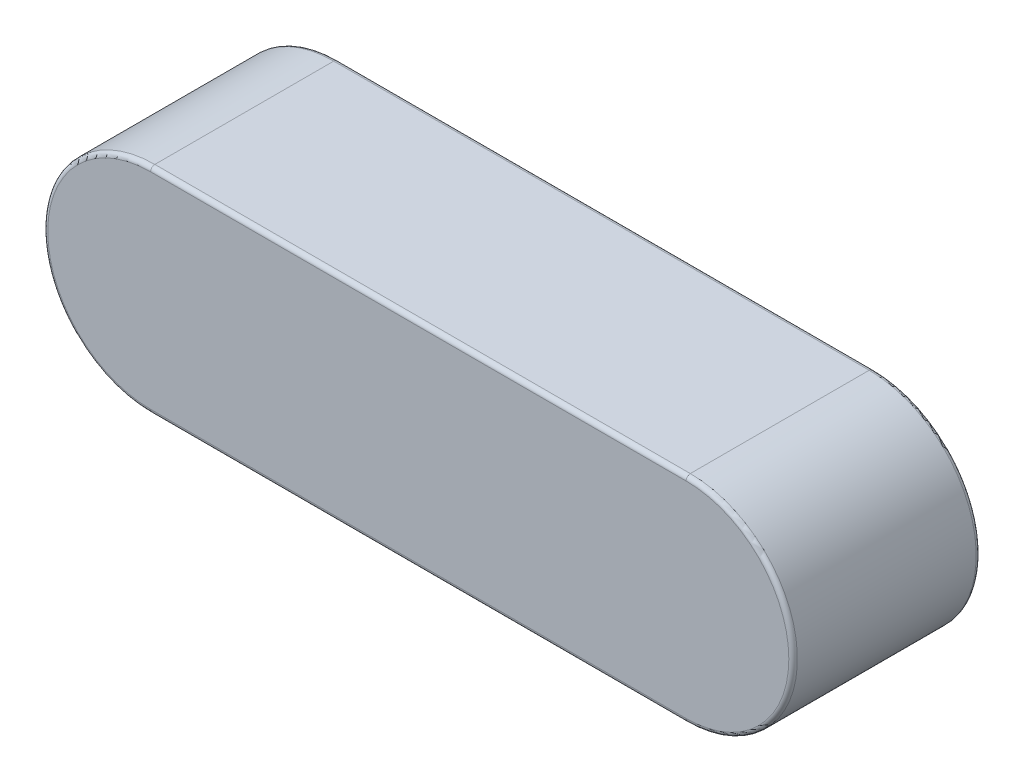
ISO-10303-21;
HEADER;
FILE_DESCRIPTION(('STEP AP214'),'2;1');
FILE_NAME('part.step','',(''),(''),'','','');
FILE_SCHEMA(('AUTOMOTIVE_DESIGN { 1 0 10303 214 1 1 1 1 }'));
ENDSEC;
DATA;
#1=APPLICATION_CONTEXT('core data for automotive mechanical design processes');
#2=APPLICATION_PROTOCOL_DEFINITION('international standard','automotive_design',2000,#1);
#3=PRODUCT_CONTEXT('',#1,'mechanical');
#4=PRODUCT('Part','Part','',(#3));
#5=PRODUCT_RELATED_PRODUCT_CATEGORY('part','',(#4));
#6=PRODUCT_DEFINITION_FORMATION('','',#4);
#7=PRODUCT_DEFINITION_CONTEXT('part definition',#1,'design');
#8=PRODUCT_DEFINITION('design','',#6,#7);
#9=PRODUCT_DEFINITION_SHAPE('','',#8);
#10=(LENGTH_UNIT() NAMED_UNIT(*) SI_UNIT(.MILLI.,.METRE.));
#11=(NAMED_UNIT(*) PLANE_ANGLE_UNIT() SI_UNIT($,.RADIAN.));
#12=(NAMED_UNIT(*) SI_UNIT($,.STERADIAN.) SOLID_ANGLE_UNIT());
#13=UNCERTAINTY_MEASURE_WITH_UNIT(LENGTH_MEASURE(1.E-05),#10,'distance_accuracy_value','');
#14=(GEOMETRIC_REPRESENTATION_CONTEXT(3) GLOBAL_UNCERTAINTY_ASSIGNED_CONTEXT((#13)) GLOBAL_UNIT_ASSIGNED_CONTEXT((#10,
#11,#12)) REPRESENTATION_CONTEXT('',''));
#15=CARTESIAN_POINT('',(0.,0.,0.));
#16=DIRECTION('',(0.,0.,1.));
#17=DIRECTION('',(1.,0.,0.));
#18=AXIS2_PLACEMENT_3D('',#15,#16,#17);
#19=CARTESIAN_POINT('',(0.,0.,7.));
#20=DIRECTION('',(0.,0.,-1.));
#21=DIRECTION('',(-1.,0.,0.));
#22=AXIS2_PLACEMENT_3D('',#19,#20,#21);
#23=CYLINDRICAL_SURFACE('',#22,4.);
#24=DIRECTION('',(0.,0.,-1.));
#25=VECTOR('',#24,1.);
#26=CARTESIAN_POINT('',(0.,4.,7.));
#27=LINE('',#26,#25);
#28=CARTESIAN_POINT('',(0.,4.,6.84));
#29=VERTEX_POINT('',#28);
#30=CARTESIAN_POINT('',(0.,4.,0.16));
#31=VERTEX_POINT('',#30);
#32=EDGE_CURVE('E164',#29,#31,#27,.T.);
#33=ORIENTED_EDGE('',*,*,#32,.T.);
#34=CARTESIAN_POINT('',(0.,0.,0.16));
#35=DIRECTION('',(0.,0.,1.));
#36=DIRECTION('',(1.,0.,0.));
#37=AXIS2_PLACEMENT_3D('',#34,#35,#36);
#38=CIRCLE('',#37,4.);
#39=CARTESIAN_POINT('',(0.,-4.,0.16));
#40=VERTEX_POINT('',#39);
#41=EDGE_CURVE('E178',#31,#40,#38,.T.);
#42=ORIENTED_EDGE('',*,*,#41,.T.);
#43=DIRECTION('',(0.,0.,-1.));
#44=VECTOR('',#43,1.);
#45=CARTESIAN_POINT('',(0.,-4.,7.));
#46=LINE('',#45,#44);
#47=CARTESIAN_POINT('',(0.,-4.,6.84));
#48=VERTEX_POINT('',#47);
#49=EDGE_CURVE('E135',#48,#40,#46,.T.);
#50=ORIENTED_EDGE('',*,*,#49,.F.);
#51=CARTESIAN_POINT('',(0.,0.,6.84));
#52=DIRECTION('',(0.,0.,1.));
#53=DIRECTION('',(1.,0.,0.));
#54=AXIS2_PLACEMENT_3D('',#51,#52,#53);
#55=CIRCLE('',#54,4.);
#56=EDGE_CURVE('E181',#48,#29,#55,.F.);
#57=ORIENTED_EDGE('',*,*,#56,.T.);
#58=EDGE_LOOP('',(#33,#42,#50,#57));
#59=FACE_BOUND('',#58,.T.);
#60=ADVANCED_FACE('F45',(#59),#23,.T.);
#61=CARTESIAN_POINT('',(0.,-4.,7.));
#62=DIRECTION('',(0.,1.,0.));
#63=DIRECTION('',(0.,0.,1.));
#64=AXIS2_PLACEMENT_3D('',#61,#62,#63);
#65=PLANE('',#64);
#66=ORIENTED_EDGE('',*,*,#49,.T.);
#67=DIRECTION('',(1.,0.,0.));
#68=VECTOR('',#67,1.);
#69=CARTESIAN_POINT('',(0.,-4.,0.16));
#70=LINE('',#69,#68);
#71=CARTESIAN_POINT('',(20.,-4.,0.16));
#72=VERTEX_POINT('',#71);
#73=EDGE_CURVE('E133',#40,#72,#70,.T.);
#74=ORIENTED_EDGE('',*,*,#73,.T.);
#75=DIRECTION('',(0.,0.,-1.));
#76=VECTOR('',#75,1.);
#77=CARTESIAN_POINT('',(20.,-4.,7.));
#78=LINE('',#77,#76);
#79=CARTESIAN_POINT('',(20.,-4.,6.84));
#80=VERTEX_POINT('',#79);
#81=EDGE_CURVE('E115',#80,#72,#78,.T.);
#82=ORIENTED_EDGE('',*,*,#81,.F.);
#83=DIRECTION('',(1.,0.,0.));
#84=VECTOR('',#83,1.);
#85=CARTESIAN_POINT('',(0.,-4.,6.84));
#86=LINE('',#85,#84);
#87=EDGE_CURVE('E130',#80,#48,#86,.F.);
#88=ORIENTED_EDGE('',*,*,#87,.T.);
#89=EDGE_LOOP('',(#66,#74,#82,#88));
#90=FACE_BOUND('',#89,.T.);
#91=ADVANCED_FACE('F129',(#90),#65,.F.);
#92=CARTESIAN_POINT('',(20.,0.,7.));
#93=DIRECTION('',(0.,0.,-1.));
#94=DIRECTION('',(-1.,0.,0.));
#95=AXIS2_PLACEMENT_3D('',#92,#93,#94);
#96=CYLINDRICAL_SURFACE('',#95,4.);
#97=ORIENTED_EDGE('',*,*,#81,.T.);
#98=CARTESIAN_POINT('',(20.,0.,0.16));
#99=DIRECTION('',(0.,0.,1.));
#100=DIRECTION('',(1.,0.,0.));
#101=AXIS2_PLACEMENT_3D('',#98,#99,#100);
#102=CIRCLE('',#101,4.);
#103=CARTESIAN_POINT('',(20.,4.,0.16));
#104=VERTEX_POINT('',#103);
#105=EDGE_CURVE('E122',#72,#104,#102,.T.);
#106=ORIENTED_EDGE('',*,*,#105,.T.);
#107=DIRECTION('',(0.,0.,-1.));
#108=VECTOR('',#107,1.);
#109=CARTESIAN_POINT('',(20.,4.,7.));
#110=LINE('',#109,#108);
#111=CARTESIAN_POINT('',(20.,4.,6.84));
#112=VERTEX_POINT('',#111);
#113=EDGE_CURVE('E117',#112,#104,#110,.T.);
#114=ORIENTED_EDGE('',*,*,#113,.F.);
#115=CARTESIAN_POINT('',(20.,0.,6.84));
#116=DIRECTION('',(0.,0.,1.));
#117=DIRECTION('',(1.,0.,0.));
#118=AXIS2_PLACEMENT_3D('',#115,#116,#117);
#119=CIRCLE('',#118,4.);
#120=EDGE_CURVE('E112',#112,#80,#119,.F.);
#121=ORIENTED_EDGE('',*,*,#120,.T.);
#122=EDGE_LOOP('',(#97,#106,#114,#121));
#123=FACE_BOUND('',#122,.T.);
#124=ADVANCED_FACE('F114',(#123),#96,.T.);
#125=CARTESIAN_POINT('',(0.,4.,7.));
#126=DIRECTION('',(0.,-1.,0.));
#127=DIRECTION('',(0.,0.,-1.));
#128=AXIS2_PLACEMENT_3D('',#125,#126,#127);
#129=PLANE('',#128);
#130=ORIENTED_EDGE('',*,*,#113,.T.);
#131=DIRECTION('',(-1.,0.,0.));
#132=VECTOR('',#131,1.);
#133=CARTESIAN_POINT('',(0.,4.,0.16));
#134=LINE('',#133,#132);
#135=EDGE_CURVE('E184',#104,#31,#134,.T.);
#136=ORIENTED_EDGE('',*,*,#135,.T.);
#137=ORIENTED_EDGE('',*,*,#32,.F.);
#138=DIRECTION('',(-1.,0.,0.));
#139=VECTOR('',#138,1.);
#140=CARTESIAN_POINT('',(20.,4.,6.84));
#141=LINE('',#140,#139);
#142=EDGE_CURVE('E187',#29,#112,#141,.F.);
#143=ORIENTED_EDGE('',*,*,#142,.T.);
#144=EDGE_LOOP('',(#130,#136,#137,#143));
#145=FACE_BOUND('',#144,.T.);
#146=ADVANCED_FACE('F235',(#145),#129,.F.);
#147=CARTESIAN_POINT('',(0.,0.,7.));
#148=DIRECTION('',(0.,0.,1.));
#149=DIRECTION('',(1.,0.,0.));
#150=AXIS2_PLACEMENT_3D('',#147,#148,#149);
#151=PLANE('',#150);
#152=CARTESIAN_POINT('',(20.,0.,7.));
#153=DIRECTION('',(0.,0.,1.));
#154=DIRECTION('',(1.,0.,0.));
#155=AXIS2_PLACEMENT_3D('',#152,#153,#154);
#156=CIRCLE('',#155,3.84);
#157=CARTESIAN_POINT('',(20.,-3.84,7.));
#158=VERTEX_POINT('',#157);
#159=CARTESIAN_POINT('',(20.,3.84,7.));
#160=VERTEX_POINT('',#159);
#161=EDGE_CURVE('E55',#158,#160,#156,.T.);
#162=ORIENTED_EDGE('',*,*,#161,.T.);
#163=DIRECTION('',(-1.,0.,0.));
#164=VECTOR('',#163,1.);
#165=CARTESIAN_POINT('',(0.,3.84,7.));
#166=LINE('',#165,#164);
#167=CARTESIAN_POINT('',(0.,3.84,7.));
#168=VERTEX_POINT('',#167);
#169=EDGE_CURVE('E11',#160,#168,#166,.T.);
#170=ORIENTED_EDGE('',*,*,#169,.T.);
#171=CARTESIAN_POINT('',(0.,0.,7.));
#172=DIRECTION('',(0.,0.,1.));
#173=DIRECTION('',(1.,0.,0.));
#174=AXIS2_PLACEMENT_3D('',#171,#172,#173);
#175=CIRCLE('',#174,3.84);
#176=CARTESIAN_POINT('',(0.,-3.84,7.));
#177=VERTEX_POINT('',#176);
#178=EDGE_CURVE('E175',#168,#177,#175,.T.);
#179=ORIENTED_EDGE('',*,*,#178,.T.);
#180=DIRECTION('',(1.,0.,0.));
#181=VECTOR('',#180,1.);
#182=CARTESIAN_POINT('',(20.,-3.84,7.));
#183=LINE('',#182,#181);
#184=EDGE_CURVE('E66',#177,#158,#183,.T.);
#185=ORIENTED_EDGE('',*,*,#184,.T.);
#186=EDGE_LOOP('',(#162,#170,#179,#185));
#187=FACE_BOUND('',#186,.T.);
#188=ADVANCED_FACE('F241',(#187),#151,.T.);
#189=CARTESIAN_POINT('',(0.,0.,0.));
#190=DIRECTION('',(0.,0.,1.));
#191=DIRECTION('',(1.,0.,0.));
#192=AXIS2_PLACEMENT_3D('',#189,#190,#191);
#193=PLANE('',#192);
#194=CARTESIAN_POINT('',(20.,0.,0.));
#195=DIRECTION('',(0.,0.,1.));
#196=DIRECTION('',(1.,0.,0.));
#197=AXIS2_PLACEMENT_3D('',#194,#195,#196);
#198=CIRCLE('',#197,3.84);
#199=CARTESIAN_POINT('',(20.,3.84,0.));
#200=VERTEX_POINT('',#199);
#201=CARTESIAN_POINT('',(20.,-3.84,0.));
#202=VERTEX_POINT('',#201);
#203=EDGE_CURVE('E195',#200,#202,#198,.F.);
#204=ORIENTED_EDGE('',*,*,#203,.T.);
#205=DIRECTION('',(1.,0.,0.));
#206=VECTOR('',#205,1.);
#207=CARTESIAN_POINT('',(0.,-3.84,0.));
#208=LINE('',#207,#206);
#209=CARTESIAN_POINT('',(0.,-3.84,0.));
#210=VERTEX_POINT('',#209);
#211=EDGE_CURVE('E123',#202,#210,#208,.F.);
#212=ORIENTED_EDGE('',*,*,#211,.T.);
#213=CARTESIAN_POINT('',(0.,0.,0.));
#214=DIRECTION('',(0.,0.,1.));
#215=DIRECTION('',(1.,0.,0.));
#216=AXIS2_PLACEMENT_3D('',#213,#214,#215);
#217=CIRCLE('',#216,3.84);
#218=CARTESIAN_POINT('',(0.,3.84,0.));
#219=VERTEX_POINT('',#218);
#220=EDGE_CURVE('E201',#210,#219,#217,.F.);
#221=ORIENTED_EDGE('',*,*,#220,.T.);
#222=DIRECTION('',(-1.,0.,0.));
#223=VECTOR('',#222,1.);
#224=CARTESIAN_POINT('',(0.,3.84,0.));
#225=LINE('',#224,#223);
#226=EDGE_CURVE('E198',#219,#200,#225,.F.);
#227=ORIENTED_EDGE('',*,*,#226,.T.);
#228=EDGE_LOOP('',(#204,#212,#221,#227));
#229=FACE_BOUND('',#228,.T.);
#230=ADVANCED_FACE('F243',(#229),#193,.F.);
#231=CARTESIAN_POINT('',(0.,3.84,0.16));
#232=DIRECTION('',(-1.,0.,0.));
#233=DIRECTION('',(0.,0.,1.));
#234=AXIS2_PLACEMENT_3D('',#231,#232,#233);
#235=CYLINDRICAL_SURFACE('',#234,0.16);
#236=CARTESIAN_POINT('',(20.,3.84,0.16));
#237=DIRECTION('',(1.,0.,0.));
#238=DIRECTION('',(0.,0.,-1.));
#239=AXIS2_PLACEMENT_3D('',#236,#237,#238);
#240=CIRCLE('',#239,0.16);
#241=EDGE_CURVE('E165',#200,#104,#240,.T.);
#242=ORIENTED_EDGE('',*,*,#241,.F.);
#243=ORIENTED_EDGE('',*,*,#226,.F.);
#244=CARTESIAN_POINT('',(0.,3.84,0.16));
#245=DIRECTION('',(-1.,0.,0.));
#246=DIRECTION('',(0.,0.,1.));
#247=AXIS2_PLACEMENT_3D('',#244,#245,#246);
#248=CIRCLE('',#247,0.16);
#249=EDGE_CURVE('E160',#31,#219,#248,.T.);
#250=ORIENTED_EDGE('',*,*,#249,.F.);
#251=ORIENTED_EDGE('',*,*,#135,.F.);
#252=EDGE_LOOP('',(#242,#243,#250,#251));
#253=FACE_BOUND('',#252,.T.);
#254=ADVANCED_FACE('F222',(#253),#235,.T.);
#255=CARTESIAN_POINT('',(0.,0.,0.16));
#256=DIRECTION('',(0.,0.,1.));
#257=DIRECTION('',(1.,0.,0.));
#258=AXIS2_PLACEMENT_3D('',#255,#256,#257);
#259=TOROIDAL_SURFACE('',#258,3.84,0.16);
#260=ORIENTED_EDGE('',*,*,#249,.T.);
#261=ORIENTED_EDGE('',*,*,#220,.F.);
#262=CARTESIAN_POINT('',(0.,-3.84,0.16));
#263=DIRECTION('',(1.,0.,0.));
#264=DIRECTION('',(0.,0.,-1.));
#265=AXIS2_PLACEMENT_3D('',#262,#263,#264);
#266=CIRCLE('',#265,0.16);
#267=EDGE_CURVE('E149',#40,#210,#266,.T.);
#268=ORIENTED_EDGE('',*,*,#267,.F.);
#269=ORIENTED_EDGE('',*,*,#41,.F.);
#270=EDGE_LOOP('',(#260,#261,#268,#269));
#271=FACE_BOUND('',#270,.T.);
#272=ADVANCED_FACE('F226',(#271),#259,.T.);
#273=CARTESIAN_POINT('',(20.,0.,0.16));
#274=DIRECTION('',(0.,0.,1.));
#275=DIRECTION('',(1.,0.,0.));
#276=AXIS2_PLACEMENT_3D('',#273,#274,#275);
#277=TOROIDAL_SURFACE('',#276,3.84,0.16);
#278=ORIENTED_EDGE('',*,*,#241,.T.);
#279=ORIENTED_EDGE('',*,*,#105,.F.);
#280=CARTESIAN_POINT('',(20.,-3.84,0.16));
#281=DIRECTION('',(-1.,0.,0.));
#282=DIRECTION('',(0.,0.,1.));
#283=AXIS2_PLACEMENT_3D('',#280,#281,#282);
#284=CIRCLE('',#283,0.16);
#285=EDGE_CURVE('E146',#202,#72,#284,.T.);
#286=ORIENTED_EDGE('',*,*,#285,.F.);
#287=ORIENTED_EDGE('',*,*,#203,.F.);
#288=EDGE_LOOP('',(#278,#279,#286,#287));
#289=FACE_BOUND('',#288,.T.);
#290=ADVANCED_FACE('F234',(#289),#277,.T.);
#291=CARTESIAN_POINT('',(0.,-3.84,0.16));
#292=DIRECTION('',(1.,0.,0.));
#293=DIRECTION('',(0.,0.,-1.));
#294=AXIS2_PLACEMENT_3D('',#291,#292,#293);
#295=CYLINDRICAL_SURFACE('',#294,0.16);
#296=ORIENTED_EDGE('',*,*,#267,.T.);
#297=ORIENTED_EDGE('',*,*,#211,.F.);
#298=ORIENTED_EDGE('',*,*,#285,.T.);
#299=ORIENTED_EDGE('',*,*,#73,.F.);
#300=EDGE_LOOP('',(#296,#297,#298,#299));
#301=FACE_BOUND('',#300,.T.);
#302=ADVANCED_FACE('F229',(#301),#295,.T.);
#303=CARTESIAN_POINT('',(0.,-3.84,6.84));
#304=DIRECTION('',(-1.,0.,0.));
#305=DIRECTION('',(0.,0.,1.));
#306=AXIS2_PLACEMENT_3D('',#303,#304,#305);
#307=CYLINDRICAL_SURFACE('',#306,0.16);
#308=CARTESIAN_POINT('',(0.,-3.84,6.84));
#309=DIRECTION('',(-1.,0.,0.));
#310=DIRECTION('',(0.,0.,1.));
#311=AXIS2_PLACEMENT_3D('',#308,#309,#310);
#312=CIRCLE('',#311,0.16);
#313=EDGE_CURVE('E140',#48,#177,#312,.T.);
#314=ORIENTED_EDGE('',*,*,#313,.F.);
#315=ORIENTED_EDGE('',*,*,#87,.F.);
#316=CARTESIAN_POINT('',(20.,-3.84,6.84));
#317=DIRECTION('',(1.,0.,0.));
#318=DIRECTION('',(0.,0.,-1.));
#319=AXIS2_PLACEMENT_3D('',#316,#317,#318);
#320=CIRCLE('',#319,0.16);
#321=EDGE_CURVE('E49',#158,#80,#320,.T.);
#322=ORIENTED_EDGE('',*,*,#321,.F.);
#323=ORIENTED_EDGE('',*,*,#184,.F.);
#324=EDGE_LOOP('',(#314,#315,#322,#323));
#325=FACE_BOUND('',#324,.T.);
#326=ADVANCED_FACE('F47',(#325),#307,.T.);
#327=CARTESIAN_POINT('',(20.,0.,6.84));
#328=DIRECTION('',(0.,0.,1.));
#329=DIRECTION('',(1.,0.,0.));
#330=AXIS2_PLACEMENT_3D('',#327,#328,#329);
#331=TOROIDAL_SURFACE('',#330,3.84,0.16);
#332=ORIENTED_EDGE('',*,*,#321,.T.);
#333=ORIENTED_EDGE('',*,*,#120,.F.);
#334=CARTESIAN_POINT('',(20.,3.84,6.84));
#335=DIRECTION('',(-1.,0.,0.));
#336=DIRECTION('',(0.,0.,1.));
#337=AXIS2_PLACEMENT_3D('',#334,#335,#336);
#338=CIRCLE('',#337,0.16);
#339=EDGE_CURVE('E151',#160,#112,#338,.T.);
#340=ORIENTED_EDGE('',*,*,#339,.F.);
#341=ORIENTED_EDGE('',*,*,#161,.F.);
#342=EDGE_LOOP('',(#332,#333,#340,#341));
#343=FACE_BOUND('',#342,.T.);
#344=ADVANCED_FACE('F144',(#343),#331,.T.);
#345=CARTESIAN_POINT('',(0.,0.,6.84));
#346=DIRECTION('',(0.,0.,1.));
#347=DIRECTION('',(1.,0.,0.));
#348=AXIS2_PLACEMENT_3D('',#345,#346,#347);
#349=TOROIDAL_SURFACE('',#348,3.84,0.16);
#350=ORIENTED_EDGE('',*,*,#313,.T.);
#351=ORIENTED_EDGE('',*,*,#178,.F.);
#352=CARTESIAN_POINT('',(0.,3.84,6.84));
#353=DIRECTION('',(1.,0.,0.));
#354=DIRECTION('',(0.,0.,-1.));
#355=AXIS2_PLACEMENT_3D('',#352,#353,#354);
#356=CIRCLE('',#355,0.16);
#357=EDGE_CURVE('E155',#29,#168,#356,.T.);
#358=ORIENTED_EDGE('',*,*,#357,.F.);
#359=ORIENTED_EDGE('',*,*,#56,.F.);
#360=EDGE_LOOP('',(#350,#351,#358,#359));
#361=FACE_BOUND('',#360,.T.);
#362=ADVANCED_FACE('F240',(#361),#349,.T.);
#363=CARTESIAN_POINT('',(0.,3.84,6.84));
#364=DIRECTION('',(1.,0.,0.));
#365=DIRECTION('',(0.,0.,-1.));
#366=AXIS2_PLACEMENT_3D('',#363,#364,#365);
#367=CYLINDRICAL_SURFACE('',#366,0.16);
#368=ORIENTED_EDGE('',*,*,#339,.T.);
#369=ORIENTED_EDGE('',*,*,#142,.F.);
#370=ORIENTED_EDGE('',*,*,#357,.T.);
#371=ORIENTED_EDGE('',*,*,#169,.F.);
#372=EDGE_LOOP('',(#368,#369,#370,#371));
#373=FACE_BOUND('',#372,.T.);
#374=ADVANCED_FACE('F238',(#373),#367,.T.);
#375=CLOSED_SHELL('',(#60,#91,#124,#146,#188,#230,#254,#272,#290,#302,#326,#344,#362,#374));
#376=MANIFOLD_SOLID_BREP('B2',#375);
#377=ADVANCED_BREP_SHAPE_REPRESENTATION('',(#18,#376),#14);
#378=SHAPE_DEFINITION_REPRESENTATION(#9,#377);
ENDSEC;
END-ISO-10303-21;
